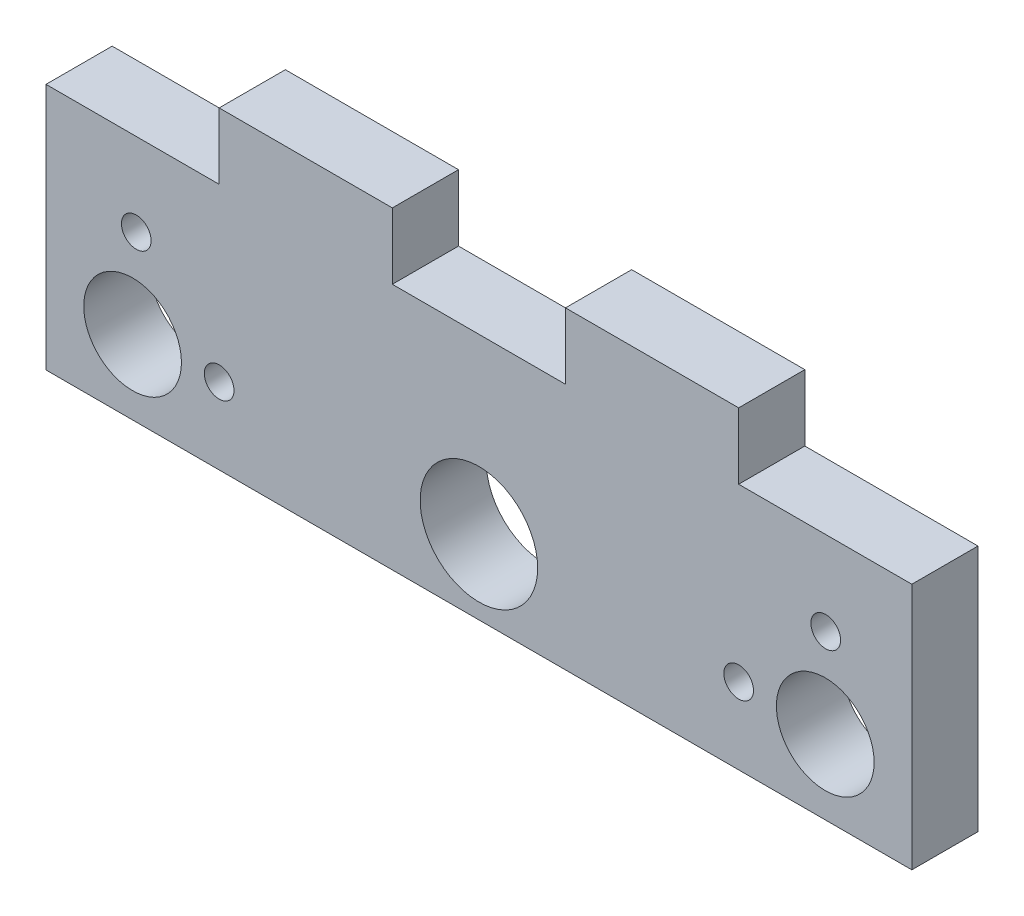
ISO-10303-21;
HEADER;
FILE_DESCRIPTION(('STEP AP214'),'2;1');
FILE_NAME('part.step','',(''),(''),'','','');
FILE_SCHEMA(('AUTOMOTIVE_DESIGN { 1 0 10303 214 1 1 1 1 }'));
ENDSEC;
DATA;
#1=APPLICATION_CONTEXT('core data for automotive mechanical design processes');
#2=APPLICATION_PROTOCOL_DEFINITION('international standard','automotive_design',2000,#1);
#3=PRODUCT_CONTEXT('',#1,'mechanical');
#4=PRODUCT('Part','Part','',(#3));
#5=PRODUCT_RELATED_PRODUCT_CATEGORY('part','',(#4));
#6=PRODUCT_DEFINITION_FORMATION('','',#4);
#7=PRODUCT_DEFINITION_CONTEXT('part definition',#1,'design');
#8=PRODUCT_DEFINITION('design','',#6,#7);
#9=PRODUCT_DEFINITION_SHAPE('','',#8);
#10=(LENGTH_UNIT() NAMED_UNIT(*) SI_UNIT(.MILLI.,.METRE.));
#11=(NAMED_UNIT(*) PLANE_ANGLE_UNIT() SI_UNIT($,.RADIAN.));
#12=(NAMED_UNIT(*) SI_UNIT($,.STERADIAN.) SOLID_ANGLE_UNIT());
#13=UNCERTAINTY_MEASURE_WITH_UNIT(LENGTH_MEASURE(1.E-05),#10,'distance_accuracy_value','');
#14=(GEOMETRIC_REPRESENTATION_CONTEXT(3) GLOBAL_UNCERTAINTY_ASSIGNED_CONTEXT((#13)) GLOBAL_UNIT_ASSIGNED_CONTEXT((#10,
#11,#12)) REPRESENTATION_CONTEXT('',''));
#15=CARTESIAN_POINT('',(0.,0.,0.));
#16=DIRECTION('',(0.,0.,1.));
#17=DIRECTION('',(1.,0.,0.));
#18=AXIS2_PLACEMENT_3D('',#15,#16,#17);
#19=CARTESIAN_POINT('',(0.,0.,5.35));
#20=DIRECTION('',(0.,0.,1.));
#21=DIRECTION('',(1.,0.,0.));
#22=AXIS2_PLACEMENT_3D('',#19,#20,#21);
#23=PLANE('',#22);
#24=CARTESIAN_POINT('',(63.04,13.199999553,5.35));
#25=DIRECTION('',(0.,0.,1.));
#26=DIRECTION('',(1.,0.,0.));
#27=AXIS2_PLACEMENT_3D('',#24,#25,#26);
#28=CIRCLE('',#27,1.19999999999999);
#29=CARTESIAN_POINT('',(64.24,13.199999553,5.35));
#30=VERTEX_POINT('',#29);
#31=EDGE_CURVE('E303',#30,#30,#28,.T.);
#32=ORIENTED_EDGE('',*,*,#31,.F.);
#33=EDGE_LOOP('',(#32));
#34=FACE_BOUND('',#33,.T.);
#35=CARTESIAN_POINT('',(14.,6.15999955299995,5.35));
#36=DIRECTION('',(0.,0.,1.));
#37=DIRECTION('',(1.,0.,0.));
#38=AXIS2_PLACEMENT_3D('',#35,#36,#37);
#39=CIRCLE('',#38,1.19999999999998);
#40=CARTESIAN_POINT('',(15.2,6.15999955299995,5.35));
#41=VERTEX_POINT('',#40);
#42=EDGE_CURVE('E315',#41,#41,#39,.T.);
#43=ORIENTED_EDGE('',*,*,#42,.F.);
#44=EDGE_LOOP('',(#43));
#45=FACE_BOUND('',#44,.T.);
#46=CARTESIAN_POINT('',(63.,5.99999955300001,5.35));
#47=DIRECTION('',(0.,0.,1.));
#48=DIRECTION('',(1.,0.,0.));
#49=AXIS2_PLACEMENT_3D('',#46,#47,#48);
#50=CIRCLE('',#49,3.95000000000001);
#51=CARTESIAN_POINT('',(66.95,5.99999955300001,5.35));
#52=VERTEX_POINT('',#51);
#53=EDGE_CURVE('E327',#52,#52,#50,.T.);
#54=ORIENTED_EDGE('',*,*,#53,.F.);
#55=EDGE_LOOP('',(#54));
#56=FACE_BOUND('',#55,.T.);
#57=DIRECTION('',(-1.,0.,0.));
#58=VECTOR('',#57,1.);
#59=CARTESIAN_POINT('',(14.0000004321,19.999999553,5.35));
#60=LINE('',#59,#58);
#61=CARTESIAN_POINT('',(14.0000004321,19.999999553,5.35));
#62=VERTEX_POINT('',#61);
#63=CARTESIAN_POINT('',(0.,19.999999553,5.35));
#64=VERTEX_POINT('',#63);
#65=EDGE_CURVE('E177',#62,#64,#60,.T.);
#66=ORIENTED_EDGE('',*,*,#65,.T.);
#67=DIRECTION('',(0.,-1.,0.));
#68=VECTOR('',#67,1.);
#69=CARTESIAN_POINT('',(0.,19.999999553,5.35));
#70=LINE('',#69,#68);
#71=CARTESIAN_POINT('',(0.,0.,5.35));
#72=VERTEX_POINT('',#71);
#73=EDGE_CURVE('E105',#64,#72,#70,.T.);
#74=ORIENTED_EDGE('',*,*,#73,.T.);
#75=DIRECTION('',(1.,0.,0.));
#76=VECTOR('',#75,1.);
#77=CARTESIAN_POINT('',(0.,0.,5.35));
#78=LINE('',#77,#76);
#79=CARTESIAN_POINT('',(70.0000002980001,0.,5.35));
#80=VERTEX_POINT('',#79);
#81=EDGE_CURVE('E204',#72,#80,#78,.T.);
#82=ORIENTED_EDGE('',*,*,#81,.T.);
#83=DIRECTION('',(0.,1.,0.));
#84=VECTOR('',#83,1.);
#85=CARTESIAN_POINT('',(70.0000002980001,0.,5.35));
#86=LINE('',#85,#84);
#87=CARTESIAN_POINT('',(70.0000002980001,19.999999553,5.35));
#88=VERTEX_POINT('',#87);
#89=EDGE_CURVE('E223',#80,#88,#86,.T.);
#90=ORIENTED_EDGE('',*,*,#89,.T.);
#91=DIRECTION('',(-1.,0.,0.));
#92=VECTOR('',#91,1.);
#93=CARTESIAN_POINT('',(70.0000002980001,19.999999553,5.35));
#94=LINE('',#93,#92);
#95=CARTESIAN_POINT('',(56.0000017285,19.999999553,5.35));
#96=VERTEX_POINT('',#95);
#97=EDGE_CURVE('E220',#88,#96,#94,.T.);
#98=ORIENTED_EDGE('',*,*,#97,.T.);
#99=DIRECTION('',(0.,1.,0.));
#100=VECTOR('',#99,1.);
#101=CARTESIAN_POINT('',(56.0000017285,19.999999553,5.35));
#102=LINE('',#101,#100);
#103=CARTESIAN_POINT('',(56.0000017285,25.349999778,5.35));
#104=VERTEX_POINT('',#103);
#105=EDGE_CURVE('E222',#96,#104,#102,.T.);
#106=ORIENTED_EDGE('',*,*,#105,.T.);
#107=DIRECTION('',(-1.,0.,0.));
#108=VECTOR('',#107,1.);
#109=CARTESIAN_POINT('',(56.0000017285,25.349999778,5.35));
#110=LINE('',#109,#108);
#111=CARTESIAN_POINT('',(41.9999994337,25.349999778,5.35));
#112=VERTEX_POINT('',#111);
#113=EDGE_CURVE('E225',#104,#112,#110,.T.);
#114=ORIENTED_EDGE('',*,*,#113,.T.);
#115=DIRECTION('',(0.,-1.,0.));
#116=VECTOR('',#115,1.);
#117=CARTESIAN_POINT('',(41.9999994337,25.349999778,5.35));
#118=LINE('',#117,#116);
#119=CARTESIAN_POINT('',(41.9999994337,19.999999553,5.35));
#120=VERTEX_POINT('',#119);
#121=EDGE_CURVE('E231',#112,#120,#118,.T.);
#122=ORIENTED_EDGE('',*,*,#121,.T.);
#123=DIRECTION('',(-1.,0.,0.));
#124=VECTOR('',#123,1.);
#125=CARTESIAN_POINT('',(41.9999994337,19.999999553,5.35));
#126=LINE('',#125,#124);
#127=CARTESIAN_POINT('',(28.0000008642,19.999999553,5.35));
#128=VERTEX_POINT('',#127);
#129=EDGE_CURVE('E136',#120,#128,#126,.T.);
#130=ORIENTED_EDGE('',*,*,#129,.T.);
#131=DIRECTION('',(0.,1.,0.));
#132=VECTOR('',#131,1.);
#133=CARTESIAN_POINT('',(28.0000008642,19.999999553,5.35));
#134=LINE('',#133,#132);
#135=CARTESIAN_POINT('',(28.0000008642,25.349999778,5.35));
#136=VERTEX_POINT('',#135);
#137=EDGE_CURVE('E130',#128,#136,#134,.T.);
#138=ORIENTED_EDGE('',*,*,#137,.T.);
#139=DIRECTION('',(-1.,0.,0.));
#140=VECTOR('',#139,1.);
#141=CARTESIAN_POINT('',(28.0000008642,25.349999778,5.35));
#142=LINE('',#141,#140);
#143=CARTESIAN_POINT('',(14.0000004321,25.349999778,5.35));
#144=VERTEX_POINT('',#143);
#145=EDGE_CURVE('E134',#136,#144,#142,.T.);
#146=ORIENTED_EDGE('',*,*,#145,.T.);
#147=DIRECTION('',(0.,-1.,0.));
#148=VECTOR('',#147,1.);
#149=CARTESIAN_POINT('',(14.0000004321,25.349999778,5.35));
#150=LINE('',#149,#148);
#151=EDGE_CURVE('E50',#144,#62,#150,.T.);
#152=ORIENTED_EDGE('',*,*,#151,.T.);
#153=EDGE_LOOP('',(#66,#74,#82,#90,#98,#106,#114,#122,#130,#138,#146,#152));
#154=FACE_BOUND('',#153,.T.);
#155=CARTESIAN_POINT('',(35.,5.99999955300001,5.35));
#156=DIRECTION('',(0.,0.,1.));
#157=DIRECTION('',(1.,0.,0.));
#158=AXIS2_PLACEMENT_3D('',#155,#156,#157);
#159=CIRCLE('',#158,4.75);
#160=CARTESIAN_POINT('',(39.75,5.99999955300001,5.35));
#161=VERTEX_POINT('',#160);
#162=EDGE_CURVE('E158',#161,#161,#159,.T.);
#163=ORIENTED_EDGE('',*,*,#162,.F.);
#164=EDGE_LOOP('',(#163));
#165=FACE_BOUND('',#164,.T.);
#166=CARTESIAN_POINT('',(7.00000000000001,5.99999955300001,5.35));
#167=DIRECTION('',(0.,0.,1.));
#168=DIRECTION('',(1.,0.,0.));
#169=AXIS2_PLACEMENT_3D('',#166,#167,#168);
#170=CIRCLE('',#169,3.95000000000001);
#171=CARTESIAN_POINT('',(10.95,5.99999955300001,5.35));
#172=VERTEX_POINT('',#171);
#173=EDGE_CURVE('E321',#172,#172,#170,.T.);
#174=ORIENTED_EDGE('',*,*,#173,.F.);
#175=EDGE_LOOP('',(#174));
#176=FACE_BOUND('',#175,.T.);
#177=CARTESIAN_POINT('',(56.,6.15999955299995,5.35));
#178=DIRECTION('',(0.,0.,1.));
#179=DIRECTION('',(1.,0.,0.));
#180=AXIS2_PLACEMENT_3D('',#177,#178,#179);
#181=CIRCLE('',#180,1.20000000000004);
#182=CARTESIAN_POINT('',(57.2,6.15999955299995,5.35));
#183=VERTEX_POINT('',#182);
#184=EDGE_CURVE('E309',#183,#183,#181,.T.);
#185=ORIENTED_EDGE('',*,*,#184,.F.);
#186=EDGE_LOOP('',(#185));
#187=FACE_BOUND('',#186,.T.);
#188=CARTESIAN_POINT('',(7.29808244979999,13.299999553,5.35));
#189=DIRECTION('',(0.,0.,1.));
#190=DIRECTION('',(1.,0.,0.));
#191=AXIS2_PLACEMENT_3D('',#188,#189,#190);
#192=CIRCLE('',#191,1.20000000000001);
#193=CARTESIAN_POINT('',(8.49808244979999,13.299999553,5.35));
#194=VERTEX_POINT('',#193);
#195=EDGE_CURVE('E294',#194,#194,#192,.T.);
#196=ORIENTED_EDGE('',*,*,#195,.F.);
#197=EDGE_LOOP('',(#196));
#198=FACE_BOUND('',#197,.T.);
#199=ADVANCED_FACE('F33',(#34,#45,#56,#154,#165,#176,#187,#198),#23,.T.);
#200=CARTESIAN_POINT('',(0.,0.,0.));
#201=DIRECTION('',(0.,0.,1.));
#202=DIRECTION('',(1.,0.,0.));
#203=AXIS2_PLACEMENT_3D('',#200,#201,#202);
#204=PLANE('',#203);
#205=DIRECTION('',(-1.,0.,0.));
#206=VECTOR('',#205,1.);
#207=CARTESIAN_POINT('',(14.0000004321,19.999999553,0.));
#208=LINE('',#207,#206);
#209=CARTESIAN_POINT('',(14.0000004321,19.999999553,0.));
#210=VERTEX_POINT('',#209);
#211=CARTESIAN_POINT('',(0.,19.999999553,0.));
#212=VERTEX_POINT('',#211);
#213=EDGE_CURVE('E154',#210,#212,#208,.T.);
#214=ORIENTED_EDGE('',*,*,#213,.F.);
#215=DIRECTION('',(0.,-1.,0.));
#216=VECTOR('',#215,1.);
#217=CARTESIAN_POINT('',(14.0000004321,25.349999778,0.));
#218=LINE('',#217,#216);
#219=CARTESIAN_POINT('',(14.0000004321,25.349999778,0.));
#220=VERTEX_POINT('',#219);
#221=EDGE_CURVE('E97',#220,#210,#218,.T.);
#222=ORIENTED_EDGE('',*,*,#221,.F.);
#223=DIRECTION('',(-1.,0.,0.));
#224=VECTOR('',#223,1.);
#225=CARTESIAN_POINT('',(28.0000008642,25.349999778,0.));
#226=LINE('',#225,#224);
#227=CARTESIAN_POINT('',(28.0000008642,25.349999778,0.));
#228=VERTEX_POINT('',#227);
#229=EDGE_CURVE('E91',#228,#220,#226,.T.);
#230=ORIENTED_EDGE('',*,*,#229,.F.);
#231=DIRECTION('',(0.,1.,0.));
#232=VECTOR('',#231,1.);
#233=CARTESIAN_POINT('',(28.0000008642,19.999999553,0.));
#234=LINE('',#233,#232);
#235=CARTESIAN_POINT('',(28.0000008642,19.999999553,0.));
#236=VERTEX_POINT('',#235);
#237=EDGE_CURVE('E144',#236,#228,#234,.T.);
#238=ORIENTED_EDGE('',*,*,#237,.F.);
#239=DIRECTION('',(-1.,0.,0.));
#240=VECTOR('',#239,1.);
#241=CARTESIAN_POINT('',(41.9999994337,19.999999553,0.));
#242=LINE('',#241,#240);
#243=CARTESIAN_POINT('',(41.9999994337,19.999999553,0.));
#244=VERTEX_POINT('',#243);
#245=EDGE_CURVE('E172',#244,#236,#242,.T.);
#246=ORIENTED_EDGE('',*,*,#245,.F.);
#247=DIRECTION('',(0.,-1.,0.));
#248=VECTOR('',#247,1.);
#249=CARTESIAN_POINT('',(41.9999994337,25.349999778,0.));
#250=LINE('',#249,#248);
#251=CARTESIAN_POINT('',(41.9999994337,25.349999778,0.));
#252=VERTEX_POINT('',#251);
#253=EDGE_CURVE('E170',#252,#244,#250,.T.);
#254=ORIENTED_EDGE('',*,*,#253,.F.);
#255=DIRECTION('',(-1.,0.,0.));
#256=VECTOR('',#255,1.);
#257=CARTESIAN_POINT('',(56.0000017285,25.349999778,0.));
#258=LINE('',#257,#256);
#259=CARTESIAN_POINT('',(56.0000017285,25.349999778,0.));
#260=VERTEX_POINT('',#259);
#261=EDGE_CURVE('E168',#260,#252,#258,.T.);
#262=ORIENTED_EDGE('',*,*,#261,.F.);
#263=DIRECTION('',(0.,1.,0.));
#264=VECTOR('',#263,1.);
#265=CARTESIAN_POINT('',(56.0000017285,19.999999553,0.));
#266=LINE('',#265,#264);
#267=CARTESIAN_POINT('',(56.0000017285,19.999999553,0.));
#268=VERTEX_POINT('',#267);
#269=EDGE_CURVE('E166',#268,#260,#266,.T.);
#270=ORIENTED_EDGE('',*,*,#269,.F.);
#271=DIRECTION('',(-1.,0.,0.));
#272=VECTOR('',#271,1.);
#273=CARTESIAN_POINT('',(70.0000002980001,19.999999553,0.));
#274=LINE('',#273,#272);
#275=CARTESIAN_POINT('',(70.0000002980001,19.999999553,0.));
#276=VERTEX_POINT('',#275);
#277=EDGE_CURVE('E164',#276,#268,#274,.T.);
#278=ORIENTED_EDGE('',*,*,#277,.F.);
#279=DIRECTION('',(0.,1.,0.));
#280=VECTOR('',#279,1.);
#281=CARTESIAN_POINT('',(70.0000002980001,0.,0.));
#282=LINE('',#281,#280);
#283=CARTESIAN_POINT('',(70.0000002980001,0.,0.));
#284=VERTEX_POINT('',#283);
#285=EDGE_CURVE('E162',#284,#276,#282,.T.);
#286=ORIENTED_EDGE('',*,*,#285,.F.);
#287=DIRECTION('',(1.,0.,0.));
#288=VECTOR('',#287,1.);
#289=CARTESIAN_POINT('',(0.,0.,0.));
#290=LINE('',#289,#288);
#291=CARTESIAN_POINT('',(0.,0.,0.));
#292=VERTEX_POINT('',#291);
#293=EDGE_CURVE('E160',#292,#284,#290,.T.);
#294=ORIENTED_EDGE('',*,*,#293,.F.);
#295=DIRECTION('',(0.,-1.,0.));
#296=VECTOR('',#295,1.);
#297=CARTESIAN_POINT('',(0.,19.999999553,0.));
#298=LINE('',#297,#296);
#299=EDGE_CURVE('E157',#212,#292,#298,.T.);
#300=ORIENTED_EDGE('',*,*,#299,.F.);
#301=EDGE_LOOP('',(#214,#222,#230,#238,#246,#254,#262,#270,#278,#286,#294,#300));
#302=FACE_BOUND('',#301,.T.);
#303=CARTESIAN_POINT('',(35.,5.99999955300001,0.));
#304=DIRECTION('',(0.,0.,1.));
#305=DIRECTION('',(1.,0.,0.));
#306=AXIS2_PLACEMENT_3D('',#303,#304,#305);
#307=CIRCLE('',#306,4.75);
#308=CARTESIAN_POINT('',(39.75,5.99999955300001,0.));
#309=VERTEX_POINT('',#308);
#310=EDGE_CURVE('E330',#309,#309,#307,.T.);
#311=ORIENTED_EDGE('',*,*,#310,.T.);
#312=EDGE_LOOP('',(#311));
#313=FACE_BOUND('',#312,.T.);
#314=CARTESIAN_POINT('',(63.,5.99999955300001,0.));
#315=DIRECTION('',(0.,0.,1.));
#316=DIRECTION('',(1.,0.,0.));
#317=AXIS2_PLACEMENT_3D('',#314,#315,#316);
#318=CIRCLE('',#317,3.95000000000001);
#319=CARTESIAN_POINT('',(66.95,5.99999955300001,0.));
#320=VERTEX_POINT('',#319);
#321=EDGE_CURVE('E324',#320,#320,#318,.T.);
#322=ORIENTED_EDGE('',*,*,#321,.T.);
#323=EDGE_LOOP('',(#322));
#324=FACE_BOUND('',#323,.T.);
#325=CARTESIAN_POINT('',(7.00000000000001,5.99999955300001,0.));
#326=DIRECTION('',(0.,0.,1.));
#327=DIRECTION('',(1.,0.,0.));
#328=AXIS2_PLACEMENT_3D('',#325,#326,#327);
#329=CIRCLE('',#328,3.95000000000001);
#330=CARTESIAN_POINT('',(10.95,5.99999955300001,0.));
#331=VERTEX_POINT('',#330);
#332=EDGE_CURVE('E318',#331,#331,#329,.T.);
#333=ORIENTED_EDGE('',*,*,#332,.T.);
#334=EDGE_LOOP('',(#333));
#335=FACE_BOUND('',#334,.T.);
#336=CARTESIAN_POINT('',(14.,6.15999955299995,0.));
#337=DIRECTION('',(0.,0.,1.));
#338=DIRECTION('',(1.,0.,0.));
#339=AXIS2_PLACEMENT_3D('',#336,#337,#338);
#340=CIRCLE('',#339,1.19999999999998);
#341=CARTESIAN_POINT('',(15.2,6.15999955299995,0.));
#342=VERTEX_POINT('',#341);
#343=EDGE_CURVE('E312',#342,#342,#340,.T.);
#344=ORIENTED_EDGE('',*,*,#343,.T.);
#345=EDGE_LOOP('',(#344));
#346=FACE_BOUND('',#345,.T.);
#347=CARTESIAN_POINT('',(56.,6.15999955299995,0.));
#348=DIRECTION('',(0.,0.,1.));
#349=DIRECTION('',(1.,0.,0.));
#350=AXIS2_PLACEMENT_3D('',#347,#348,#349);
#351=CIRCLE('',#350,1.20000000000004);
#352=CARTESIAN_POINT('',(57.2,6.15999955299995,0.));
#353=VERTEX_POINT('',#352);
#354=EDGE_CURVE('E306',#353,#353,#351,.T.);
#355=ORIENTED_EDGE('',*,*,#354,.T.);
#356=EDGE_LOOP('',(#355));
#357=FACE_BOUND('',#356,.T.);
#358=CARTESIAN_POINT('',(63.04,13.199999553,0.));
#359=DIRECTION('',(0.,0.,1.));
#360=DIRECTION('',(1.,0.,0.));
#361=AXIS2_PLACEMENT_3D('',#358,#359,#360);
#362=CIRCLE('',#361,1.19999999999999);
#363=CARTESIAN_POINT('',(64.24,13.199999553,0.));
#364=VERTEX_POINT('',#363);
#365=EDGE_CURVE('E300',#364,#364,#362,.T.);
#366=ORIENTED_EDGE('',*,*,#365,.T.);
#367=EDGE_LOOP('',(#366));
#368=FACE_BOUND('',#367,.T.);
#369=CARTESIAN_POINT('',(7.29808244979999,13.299999553,0.));
#370=DIRECTION('',(0.,0.,1.));
#371=DIRECTION('',(1.,0.,0.));
#372=AXIS2_PLACEMENT_3D('',#369,#370,#371);
#373=CIRCLE('',#372,1.20000000000001);
#374=CARTESIAN_POINT('',(8.49808244979999,13.299999553,0.));
#375=VERTEX_POINT('',#374);
#376=EDGE_CURVE('E297',#375,#375,#373,.T.);
#377=ORIENTED_EDGE('',*,*,#376,.T.);
#378=EDGE_LOOP('',(#377));
#379=FACE_BOUND('',#378,.T.);
#380=ADVANCED_FACE('F208',(#302,#313,#324,#335,#346,#357,#368,#379),#204,.F.);
#381=CARTESIAN_POINT('',(14.0000004321,19.999999553,5.35));
#382=DIRECTION('',(0.,-1.,0.));
#383=DIRECTION('',(0.,0.,-1.));
#384=AXIS2_PLACEMENT_3D('',#381,#382,#383);
#385=PLANE('',#384);
#386=ORIENTED_EDGE('',*,*,#213,.T.);
#387=DIRECTION('',(0.,0.,-1.));
#388=VECTOR('',#387,1.);
#389=CARTESIAN_POINT('',(0.,19.999999553,5.35));
#390=LINE('',#389,#388);
#391=EDGE_CURVE('E11',#64,#212,#390,.T.);
#392=ORIENTED_EDGE('',*,*,#391,.F.);
#393=ORIENTED_EDGE('',*,*,#65,.F.);
#394=DIRECTION('',(0.,0.,-1.));
#395=VECTOR('',#394,1.);
#396=CARTESIAN_POINT('',(14.0000004321,19.999999553,5.35));
#397=LINE('',#396,#395);
#398=EDGE_CURVE('E150',#62,#210,#397,.T.);
#399=ORIENTED_EDGE('',*,*,#398,.T.);
#400=EDGE_LOOP('',(#386,#392,#393,#399));
#401=FACE_BOUND('',#400,.T.);
#402=ADVANCED_FACE('F35',(#401),#385,.F.);
#403=CARTESIAN_POINT('',(0.,19.999999553,5.35));
#404=DIRECTION('',(1.,0.,0.));
#405=DIRECTION('',(0.,0.,-1.));
#406=AXIS2_PLACEMENT_3D('',#403,#404,#405);
#407=PLANE('',#406);
#408=ORIENTED_EDGE('',*,*,#299,.T.);
#409=DIRECTION('',(0.,0.,-1.));
#410=VECTOR('',#409,1.);
#411=CARTESIAN_POINT('',(0.,0.,5.35));
#412=LINE('',#411,#410);
#413=EDGE_CURVE('E42',#72,#292,#412,.T.);
#414=ORIENTED_EDGE('',*,*,#413,.F.);
#415=ORIENTED_EDGE('',*,*,#73,.F.);
#416=ORIENTED_EDGE('',*,*,#391,.T.);
#417=EDGE_LOOP('',(#408,#414,#415,#416));
#418=FACE_BOUND('',#417,.T.);
#419=ADVANCED_FACE('F467',(#418),#407,.F.);
#420=CARTESIAN_POINT('',(0.,0.,5.35));
#421=DIRECTION('',(0.,1.,0.));
#422=DIRECTION('',(0.,0.,1.));
#423=AXIS2_PLACEMENT_3D('',#420,#421,#422);
#424=PLANE('',#423);
#425=ORIENTED_EDGE('',*,*,#293,.T.);
#426=DIRECTION('',(0.,0.,-1.));
#427=VECTOR('',#426,1.);
#428=CARTESIAN_POINT('',(70.0000002980001,0.,5.35));
#429=LINE('',#428,#427);
#430=EDGE_CURVE('E196',#80,#284,#429,.T.);
#431=ORIENTED_EDGE('',*,*,#430,.F.);
#432=ORIENTED_EDGE('',*,*,#81,.F.);
#433=ORIENTED_EDGE('',*,*,#413,.T.);
#434=EDGE_LOOP('',(#425,#431,#432,#433));
#435=FACE_BOUND('',#434,.T.);
#436=ADVANCED_FACE('F202',(#435),#424,.F.);
#437=CARTESIAN_POINT('',(70.0000002980001,0.,5.35));
#438=DIRECTION('',(-1.,0.,0.));
#439=DIRECTION('',(0.,0.,1.));
#440=AXIS2_PLACEMENT_3D('',#437,#438,#439);
#441=PLANE('',#440);
#442=ORIENTED_EDGE('',*,*,#285,.T.);
#443=DIRECTION('',(0.,0.,-1.));
#444=VECTOR('',#443,1.);
#445=CARTESIAN_POINT('',(70.0000002980001,19.999999553,5.35));
#446=LINE('',#445,#444);
#447=EDGE_CURVE('E193',#88,#276,#446,.T.);
#448=ORIENTED_EDGE('',*,*,#447,.F.);
#449=ORIENTED_EDGE('',*,*,#89,.F.);
#450=ORIENTED_EDGE('',*,*,#430,.T.);
#451=EDGE_LOOP('',(#442,#448,#449,#450));
#452=FACE_BOUND('',#451,.T.);
#453=ADVANCED_FACE('F214',(#452),#441,.F.);
#454=CARTESIAN_POINT('',(70.0000002980001,19.999999553,5.35));
#455=DIRECTION('',(0.,-1.,0.));
#456=DIRECTION('',(0.,0.,-1.));
#457=AXIS2_PLACEMENT_3D('',#454,#455,#456);
#458=PLANE('',#457);
#459=ORIENTED_EDGE('',*,*,#277,.T.);
#460=DIRECTION('',(0.,0.,-1.));
#461=VECTOR('',#460,1.);
#462=CARTESIAN_POINT('',(56.0000017285,19.999999553,5.35));
#463=LINE('',#462,#461);
#464=EDGE_CURVE('E190',#96,#268,#463,.T.);
#465=ORIENTED_EDGE('',*,*,#464,.F.);
#466=ORIENTED_EDGE('',*,*,#97,.F.);
#467=ORIENTED_EDGE('',*,*,#447,.T.);
#468=EDGE_LOOP('',(#459,#465,#466,#467));
#469=FACE_BOUND('',#468,.T.);
#470=ADVANCED_FACE('F218',(#469),#458,.F.);
#471=CARTESIAN_POINT('',(56.0000017285,19.999999553,5.35));
#472=DIRECTION('',(-1.,0.,0.));
#473=DIRECTION('',(0.,0.,1.));
#474=AXIS2_PLACEMENT_3D('',#471,#472,#473);
#475=PLANE('',#474);
#476=ORIENTED_EDGE('',*,*,#269,.T.);
#477=DIRECTION('',(0.,0.,-1.));
#478=VECTOR('',#477,1.);
#479=CARTESIAN_POINT('',(56.0000017285,25.349999778,5.35));
#480=LINE('',#479,#478);
#481=EDGE_CURVE('E187',#104,#260,#480,.T.);
#482=ORIENTED_EDGE('',*,*,#481,.F.);
#483=ORIENTED_EDGE('',*,*,#105,.F.);
#484=ORIENTED_EDGE('',*,*,#464,.T.);
#485=EDGE_LOOP('',(#476,#482,#483,#484));
#486=FACE_BOUND('',#485,.T.);
#487=ADVANCED_FACE('F432',(#486),#475,.F.);
#488=CARTESIAN_POINT('',(56.0000017285,25.349999778,5.35));
#489=DIRECTION('',(0.,-1.,0.));
#490=DIRECTION('',(0.,0.,-1.));
#491=AXIS2_PLACEMENT_3D('',#488,#489,#490);
#492=PLANE('',#491);
#493=ORIENTED_EDGE('',*,*,#261,.T.);
#494=DIRECTION('',(0.,0.,-1.));
#495=VECTOR('',#494,1.);
#496=CARTESIAN_POINT('',(41.9999994337,25.349999778,5.35));
#497=LINE('',#496,#495);
#498=EDGE_CURVE('E184',#112,#252,#497,.T.);
#499=ORIENTED_EDGE('',*,*,#498,.F.);
#500=ORIENTED_EDGE('',*,*,#113,.F.);
#501=ORIENTED_EDGE('',*,*,#481,.T.);
#502=EDGE_LOOP('',(#493,#499,#500,#501));
#503=FACE_BOUND('',#502,.T.);
#504=ADVANCED_FACE('F423',(#503),#492,.F.);
#505=CARTESIAN_POINT('',(41.9999994337,25.349999778,5.35));
#506=DIRECTION('',(1.,0.,0.));
#507=DIRECTION('',(0.,0.,-1.));
#508=AXIS2_PLACEMENT_3D('',#505,#506,#507);
#509=PLANE('',#508);
#510=ORIENTED_EDGE('',*,*,#253,.T.);
#511=DIRECTION('',(0.,0.,-1.));
#512=VECTOR('',#511,1.);
#513=CARTESIAN_POINT('',(41.9999994337,19.999999553,5.35));
#514=LINE('',#513,#512);
#515=EDGE_CURVE('E181',#120,#244,#514,.T.);
#516=ORIENTED_EDGE('',*,*,#515,.F.);
#517=ORIENTED_EDGE('',*,*,#121,.F.);
#518=ORIENTED_EDGE('',*,*,#498,.T.);
#519=EDGE_LOOP('',(#510,#516,#517,#518));
#520=FACE_BOUND('',#519,.T.);
#521=ADVANCED_FACE('F237',(#520),#509,.F.);
#522=CARTESIAN_POINT('',(41.9999994337,19.999999553,5.35));
#523=DIRECTION('',(0.,-1.,0.));
#524=DIRECTION('',(0.,0.,-1.));
#525=AXIS2_PLACEMENT_3D('',#522,#523,#524);
#526=PLANE('',#525);
#527=ORIENTED_EDGE('',*,*,#245,.T.);
#528=DIRECTION('',(0.,0.,-1.));
#529=VECTOR('',#528,1.);
#530=CARTESIAN_POINT('',(28.0000008642,19.999999553,5.35));
#531=LINE('',#530,#529);
#532=EDGE_CURVE('E145',#128,#236,#531,.T.);
#533=ORIENTED_EDGE('',*,*,#532,.F.);
#534=ORIENTED_EDGE('',*,*,#129,.F.);
#535=ORIENTED_EDGE('',*,*,#515,.T.);
#536=EDGE_LOOP('',(#527,#533,#534,#535));
#537=FACE_BOUND('',#536,.T.);
#538=ADVANCED_FACE('F241',(#537),#526,.F.);
#539=CARTESIAN_POINT('',(28.0000008642,19.999999553,5.35));
#540=DIRECTION('',(-1.,0.,0.));
#541=DIRECTION('',(0.,0.,1.));
#542=AXIS2_PLACEMENT_3D('',#539,#540,#541);
#543=PLANE('',#542);
#544=ORIENTED_EDGE('',*,*,#237,.T.);
#545=DIRECTION('',(0.,0.,-1.));
#546=VECTOR('',#545,1.);
#547=CARTESIAN_POINT('',(28.0000008642,25.349999778,5.35));
#548=LINE('',#547,#546);
#549=EDGE_CURVE('E141',#136,#228,#548,.T.);
#550=ORIENTED_EDGE('',*,*,#549,.F.);
#551=ORIENTED_EDGE('',*,*,#137,.F.);
#552=ORIENTED_EDGE('',*,*,#532,.T.);
#553=EDGE_LOOP('',(#544,#550,#551,#552));
#554=FACE_BOUND('',#553,.T.);
#555=ADVANCED_FACE('F142',(#554),#543,.F.);
#556=CARTESIAN_POINT('',(28.0000008642,25.349999778,5.35));
#557=DIRECTION('',(0.,-1.,0.));
#558=DIRECTION('',(0.,0.,-1.));
#559=AXIS2_PLACEMENT_3D('',#556,#557,#558);
#560=PLANE('',#559);
#561=ORIENTED_EDGE('',*,*,#229,.T.);
#562=DIRECTION('',(0.,0.,-1.));
#563=VECTOR('',#562,1.);
#564=CARTESIAN_POINT('',(14.0000004321,25.349999778,5.35));
#565=LINE('',#564,#563);
#566=EDGE_CURVE('E146',#144,#220,#565,.T.);
#567=ORIENTED_EDGE('',*,*,#566,.F.);
#568=ORIENTED_EDGE('',*,*,#145,.F.);
#569=ORIENTED_EDGE('',*,*,#549,.T.);
#570=EDGE_LOOP('',(#561,#567,#568,#569));
#571=FACE_BOUND('',#570,.T.);
#572=ADVANCED_FACE('F148',(#571),#560,.F.);
#573=CARTESIAN_POINT('',(14.0000004321,25.349999778,5.35));
#574=DIRECTION('',(1.,0.,0.));
#575=DIRECTION('',(0.,0.,-1.));
#576=AXIS2_PLACEMENT_3D('',#573,#574,#575);
#577=PLANE('',#576);
#578=ORIENTED_EDGE('',*,*,#221,.T.);
#579=ORIENTED_EDGE('',*,*,#398,.F.);
#580=ORIENTED_EDGE('',*,*,#151,.F.);
#581=ORIENTED_EDGE('',*,*,#566,.T.);
#582=EDGE_LOOP('',(#578,#579,#580,#581));
#583=FACE_BOUND('',#582,.T.);
#584=ADVANCED_FACE('F245',(#583),#577,.F.);
#585=CARTESIAN_POINT('',(35.,5.99999955300001,5.35));
#586=DIRECTION('',(0.,0.,-1.));
#587=DIRECTION('',(-1.,0.,0.));
#588=AXIS2_PLACEMENT_3D('',#585,#586,#587);
#589=CYLINDRICAL_SURFACE('',#588,4.75);
#590=ORIENTED_EDGE('',*,*,#162,.T.);
#591=EDGE_LOOP('',(#590));
#592=FACE_BOUND('',#591,.T.);
#593=ORIENTED_EDGE('',*,*,#310,.F.);
#594=EDGE_LOOP('',(#593));
#595=FACE_BOUND('',#594,.T.);
#596=ADVANCED_FACE('F247',(#592,#595),#589,.F.);
#597=CARTESIAN_POINT('',(63.,5.99999955300001,5.35));
#598=DIRECTION('',(0.,0.,-1.));
#599=DIRECTION('',(-1.,0.,0.));
#600=AXIS2_PLACEMENT_3D('',#597,#598,#599);
#601=CYLINDRICAL_SURFACE('',#600,3.95000000000001);
#602=ORIENTED_EDGE('',*,*,#53,.T.);
#603=EDGE_LOOP('',(#602));
#604=FACE_BOUND('',#603,.T.);
#605=ORIENTED_EDGE('',*,*,#321,.F.);
#606=EDGE_LOOP('',(#605));
#607=FACE_BOUND('',#606,.T.);
#608=ADVANCED_FACE('F253',(#604,#607),#601,.F.);
#609=CARTESIAN_POINT('',(7.00000000000001,5.99999955300001,5.35));
#610=DIRECTION('',(0.,0.,-1.));
#611=DIRECTION('',(-1.,0.,0.));
#612=AXIS2_PLACEMENT_3D('',#609,#610,#611);
#613=CYLINDRICAL_SURFACE('',#612,3.95000000000001);
#614=ORIENTED_EDGE('',*,*,#173,.T.);
#615=EDGE_LOOP('',(#614));
#616=FACE_BOUND('',#615,.T.);
#617=ORIENTED_EDGE('',*,*,#332,.F.);
#618=EDGE_LOOP('',(#617));
#619=FACE_BOUND('',#618,.T.);
#620=ADVANCED_FACE('F269',(#616,#619),#613,.F.);
#621=CARTESIAN_POINT('',(14.,6.15999955299995,5.35));
#622=DIRECTION('',(0.,0.,-1.));
#623=DIRECTION('',(-1.,0.,0.));
#624=AXIS2_PLACEMENT_3D('',#621,#622,#623);
#625=CYLINDRICAL_SURFACE('',#624,1.19999999999998);
#626=ORIENTED_EDGE('',*,*,#42,.T.);
#627=EDGE_LOOP('',(#626));
#628=FACE_BOUND('',#627,.T.);
#629=ORIENTED_EDGE('',*,*,#343,.F.);
#630=EDGE_LOOP('',(#629));
#631=FACE_BOUND('',#630,.T.);
#632=ADVANCED_FACE('F273',(#628,#631),#625,.F.);
#633=CARTESIAN_POINT('',(56.,6.15999955299995,5.35));
#634=DIRECTION('',(0.,0.,-1.));
#635=DIRECTION('',(-1.,0.,0.));
#636=AXIS2_PLACEMENT_3D('',#633,#634,#635);
#637=CYLINDRICAL_SURFACE('',#636,1.20000000000004);
#638=ORIENTED_EDGE('',*,*,#184,.T.);
#639=EDGE_LOOP('',(#638));
#640=FACE_BOUND('',#639,.T.);
#641=ORIENTED_EDGE('',*,*,#354,.F.);
#642=EDGE_LOOP('',(#641));
#643=FACE_BOUND('',#642,.T.);
#644=ADVANCED_FACE('F277',(#640,#643),#637,.F.);
#645=CARTESIAN_POINT('',(63.04,13.199999553,5.35));
#646=DIRECTION('',(0.,0.,-1.));
#647=DIRECTION('',(-1.,0.,0.));
#648=AXIS2_PLACEMENT_3D('',#645,#646,#647);
#649=CYLINDRICAL_SURFACE('',#648,1.19999999999999);
#650=ORIENTED_EDGE('',*,*,#31,.T.);
#651=EDGE_LOOP('',(#650));
#652=FACE_BOUND('',#651,.T.);
#653=ORIENTED_EDGE('',*,*,#365,.F.);
#654=EDGE_LOOP('',(#653));
#655=FACE_BOUND('',#654,.T.);
#656=ADVANCED_FACE('F281',(#652,#655),#649,.F.);
#657=CARTESIAN_POINT('',(7.29808244979999,13.299999553,5.35));
#658=DIRECTION('',(0.,0.,-1.));
#659=DIRECTION('',(-1.,0.,0.));
#660=AXIS2_PLACEMENT_3D('',#657,#658,#659);
#661=CYLINDRICAL_SURFACE('',#660,1.20000000000001);
#662=ORIENTED_EDGE('',*,*,#195,.T.);
#663=EDGE_LOOP('',(#662));
#664=FACE_BOUND('',#663,.T.);
#665=ORIENTED_EDGE('',*,*,#376,.F.);
#666=EDGE_LOOP('',(#665));
#667=FACE_BOUND('',#666,.T.);
#668=ADVANCED_FACE('F285',(#664,#667),#661,.F.);
#669=CLOSED_SHELL('',(#199,#380,#402,#419,#436,#453,#470,#487,#504,#521,#538,#555,#572,#584,
#596,#608,#620,#632,#644,#656,#668));
#670=MANIFOLD_SOLID_BREP('B2',#669);
#671=ADVANCED_BREP_SHAPE_REPRESENTATION('',(#18,#670),#14);
#672=SHAPE_DEFINITION_REPRESENTATION(#9,#671);
ENDSEC;
END-ISO-10303-21;
